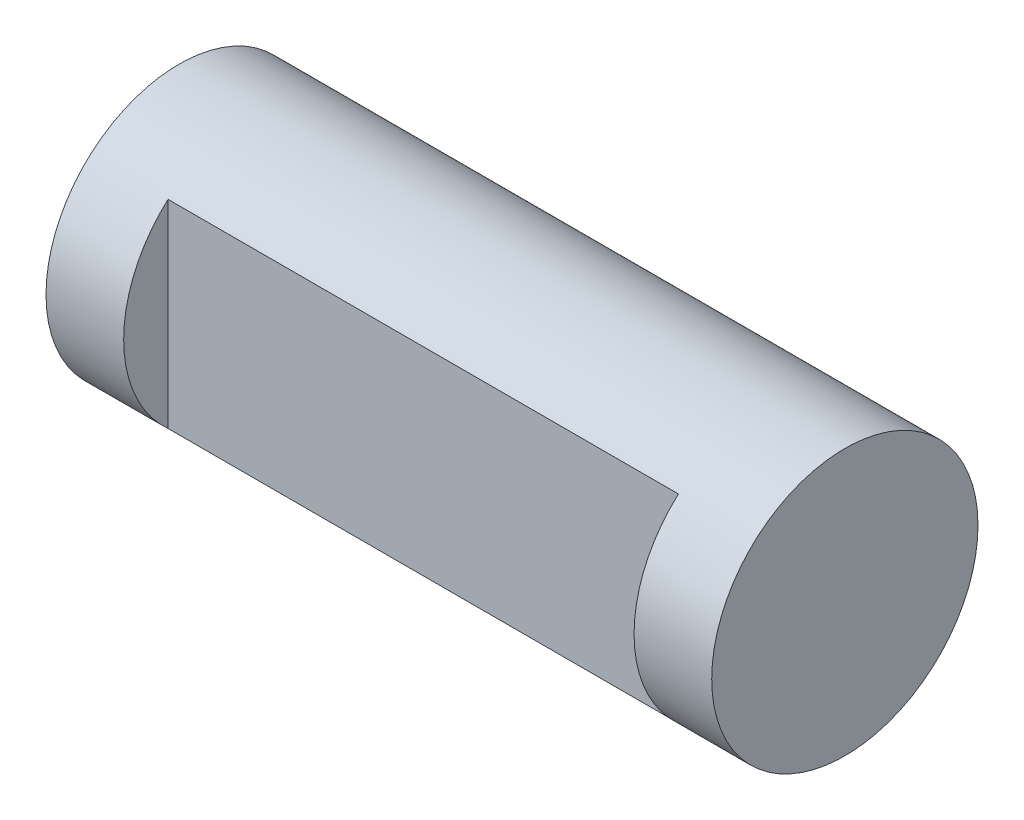
ISO-10303-21;
HEADER;
FILE_DESCRIPTION(('STEP AP214'),'2;1');
FILE_NAME('part.step','',(''),(''),'','','');
FILE_SCHEMA(('AUTOMOTIVE_DESIGN { 1 0 10303 214 1 1 1 1 }'));
ENDSEC;
DATA;
#1=APPLICATION_CONTEXT('core data for automotive mechanical design processes');
#2=APPLICATION_PROTOCOL_DEFINITION('international standard','automotive_design',2000,#1);
#3=PRODUCT_CONTEXT('',#1,'mechanical');
#4=PRODUCT('Part','Part','',(#3));
#5=PRODUCT_RELATED_PRODUCT_CATEGORY('part','',(#4));
#6=PRODUCT_DEFINITION_FORMATION('','',#4);
#7=PRODUCT_DEFINITION_CONTEXT('part definition',#1,'design');
#8=PRODUCT_DEFINITION('design','',#6,#7);
#9=PRODUCT_DEFINITION_SHAPE('','',#8);
#10=(LENGTH_UNIT() NAMED_UNIT(*) SI_UNIT(.MILLI.,.METRE.));
#11=(NAMED_UNIT(*) PLANE_ANGLE_UNIT() SI_UNIT($,.RADIAN.));
#12=(NAMED_UNIT(*) SI_UNIT($,.STERADIAN.) SOLID_ANGLE_UNIT());
#13=UNCERTAINTY_MEASURE_WITH_UNIT(LENGTH_MEASURE(1.E-05),#10,'distance_accuracy_value','');
#14=(GEOMETRIC_REPRESENTATION_CONTEXT(3) GLOBAL_UNCERTAINTY_ASSIGNED_CONTEXT((#13)) GLOBAL_UNIT_ASSIGNED_CONTEXT((#10,
#11,#12)) REPRESENTATION_CONTEXT('',''));
#15=CARTESIAN_POINT('',(0.,0.,0.));
#16=DIRECTION('',(0.,0.,1.));
#17=DIRECTION('',(1.,0.,0.));
#18=AXIS2_PLACEMENT_3D('',#15,#16,#17);
#19=CARTESIAN_POINT('',(0.,0.,0.));
#20=DIRECTION('',(-1.,0.,0.));
#21=DIRECTION('',(0.,0.,1.));
#22=AXIS2_PLACEMENT_3D('',#19,#20,#21);
#23=CYLINDRICAL_SURFACE('',#22,12.);
#24=CARTESIAN_POINT('',(60.,0.,0.));
#25=DIRECTION('',(-1.,0.,0.));
#26=DIRECTION('',(0.,0.,1.));
#27=AXIS2_PLACEMENT_3D('',#24,#25,#26);
#28=CIRCLE('',#27,12.);
#29=CARTESIAN_POINT('',(60.,0.,12.));
#30=VERTEX_POINT('',#29);
#31=EDGE_CURVE('E12',#30,#30,#28,.T.);
#32=ORIENTED_EDGE('',*,*,#31,.T.);
#33=EDGE_LOOP('',(#32));
#34=FACE_BOUND('',#33,.T.);
#35=CARTESIAN_POINT('',(0.,0.,0.));
#36=DIRECTION('',(-1.,0.,0.));
#37=DIRECTION('',(0.,0.,1.));
#38=AXIS2_PLACEMENT_3D('',#35,#36,#37);
#39=CIRCLE('',#38,12.);
#40=CARTESIAN_POINT('',(0.,0.,12.));
#41=VERTEX_POINT('',#40);
#42=EDGE_CURVE('E43',#41,#41,#39,.T.);
#43=ORIENTED_EDGE('',*,*,#42,.F.);
#44=EDGE_LOOP('',(#43));
#45=FACE_BOUND('',#44,.T.);
#46=CARTESIAN_POINT('',(53.,0.,0.));
#47=DIRECTION('',(-1.,0.,0.));
#48=DIRECTION('',(0.,0.,1.));
#49=AXIS2_PLACEMENT_3D('',#46,#47,#48);
#50=CIRCLE('',#49,12.);
#51=CARTESIAN_POINT('',(53.,8.94427190999914,8.));
#52=VERTEX_POINT('',#51);
#53=CARTESIAN_POINT('',(53.,-8.94427190999914,8.));
#54=VERTEX_POINT('',#53);
#55=EDGE_CURVE('E74',#52,#54,#50,.F.);
#56=ORIENTED_EDGE('',*,*,#55,.T.);
#57=DIRECTION('',(-1.,0.,0.));
#58=VECTOR('',#57,1.);
#59=CARTESIAN_POINT('',(78.3303027798233,-8.94427190999914,8.));
#60=LINE('',#59,#58);
#61=CARTESIAN_POINT('',(7.,-8.94427190999914,8.));
#62=VERTEX_POINT('',#61);
#63=EDGE_CURVE('E64',#54,#62,#60,.T.);
#64=ORIENTED_EDGE('',*,*,#63,.T.);
#65=CARTESIAN_POINT('',(7.,0.,0.));
#66=DIRECTION('',(1.,0.,0.));
#67=DIRECTION('',(0.,0.,-1.));
#68=AXIS2_PLACEMENT_3D('',#65,#66,#67);
#69=CIRCLE('',#68,12.);
#70=CARTESIAN_POINT('',(7.,8.94427190999914,8.));
#71=VERTEX_POINT('',#70);
#72=EDGE_CURVE('E69',#71,#62,#69,.T.);
#73=ORIENTED_EDGE('',*,*,#72,.F.);
#74=DIRECTION('',(-1.,0.,0.));
#75=VECTOR('',#74,1.);
#76=CARTESIAN_POINT('',(78.3303027798233,8.94427190999914,8.));
#77=LINE('',#76,#75);
#78=EDGE_CURVE('E67',#52,#71,#77,.T.);
#79=ORIENTED_EDGE('',*,*,#78,.F.);
#80=EDGE_LOOP('',(#56,#64,#73,#79));
#81=FACE_BOUND('',#80,.T.);
#82=ADVANCED_FACE('F35',(#34,#45,#81),#23,.T.);
#83=CARTESIAN_POINT('',(0.,12.,0.));
#84=DIRECTION('',(1.,0.,0.));
#85=DIRECTION('',(0.,0.,-1.));
#86=AXIS2_PLACEMENT_3D('',#83,#84,#85);
#87=PLANE('',#86);
#88=ORIENTED_EDGE('',*,*,#42,.T.);
#89=EDGE_LOOP('',(#88));
#90=FACE_BOUND('',#89,.T.);
#91=ADVANCED_FACE('F37',(#90),#87,.F.);
#92=CARTESIAN_POINT('',(60.,0.,0.));
#93=DIRECTION('',(-1.,0.,0.));
#94=DIRECTION('',(0.,0.,1.));
#95=AXIS2_PLACEMENT_3D('',#92,#93,#94);
#96=PLANE('',#95);
#97=ORIENTED_EDGE('',*,*,#31,.F.);
#98=EDGE_LOOP('',(#97));
#99=FACE_BOUND('',#98,.T.);
#100=ADVANCED_FACE('F89',(#99),#96,.F.);
#101=CARTESIAN_POINT('',(78.3303027798233,0.,8.));
#102=DIRECTION('',(0.,0.,-1.));
#103=DIRECTION('',(-1.,0.,0.));
#104=AXIS2_PLACEMENT_3D('',#101,#102,#103);
#105=PLANE('',#104);
#106=DIRECTION('',(0.,1.,0.));
#107=VECTOR('',#106,1.);
#108=CARTESIAN_POINT('',(53.,0.,8.));
#109=LINE('',#108,#107);
#110=EDGE_CURVE('E56',#54,#52,#109,.T.);
#111=ORIENTED_EDGE('',*,*,#110,.T.);
#112=ORIENTED_EDGE('',*,*,#78,.T.);
#113=DIRECTION('',(0.,1.,0.));
#114=VECTOR('',#113,1.);
#115=CARTESIAN_POINT('',(7.,0.,8.));
#116=LINE('',#115,#114);
#117=EDGE_CURVE('E49',#62,#71,#116,.T.);
#118=ORIENTED_EDGE('',*,*,#117,.F.);
#119=ORIENTED_EDGE('',*,*,#63,.F.);
#120=EDGE_LOOP('',(#111,#112,#118,#119));
#121=FACE_BOUND('',#120,.T.);
#122=ADVANCED_FACE('F62',(#121),#105,.F.);
#123=CARTESIAN_POINT('',(53.,0.,0.));
#124=DIRECTION('',(-1.,0.,0.));
#125=DIRECTION('',(0.,0.,1.));
#126=AXIS2_PLACEMENT_3D('',#123,#124,#125);
#127=PLANE('',#126);
#128=ORIENTED_EDGE('',*,*,#110,.F.);
#129=ORIENTED_EDGE('',*,*,#55,.F.);
#130=EDGE_LOOP('',(#128,#129));
#131=FACE_BOUND('',#130,.T.);
#132=ADVANCED_FACE('F97',(#131),#127,.T.);
#133=CARTESIAN_POINT('',(7.,12.,0.));
#134=DIRECTION('',(1.,0.,0.));
#135=DIRECTION('',(0.,0.,-1.));
#136=AXIS2_PLACEMENT_3D('',#133,#134,#135);
#137=PLANE('',#136);
#138=ORIENTED_EDGE('',*,*,#72,.T.);
#139=ORIENTED_EDGE('',*,*,#117,.T.);
#140=EDGE_LOOP('',(#138,#139));
#141=FACE_BOUND('',#140,.T.);
#142=ADVANCED_FACE('F71',(#141),#137,.T.);
#143=CLOSED_SHELL('',(#82,#91,#100,#122,#132,#142));
#144=MANIFOLD_SOLID_BREP('B2',#143);
#145=ADVANCED_BREP_SHAPE_REPRESENTATION('',(#18,#144),#14);
#146=SHAPE_DEFINITION_REPRESENTATION(#9,#145);
ENDSEC;
END-ISO-10303-21;
